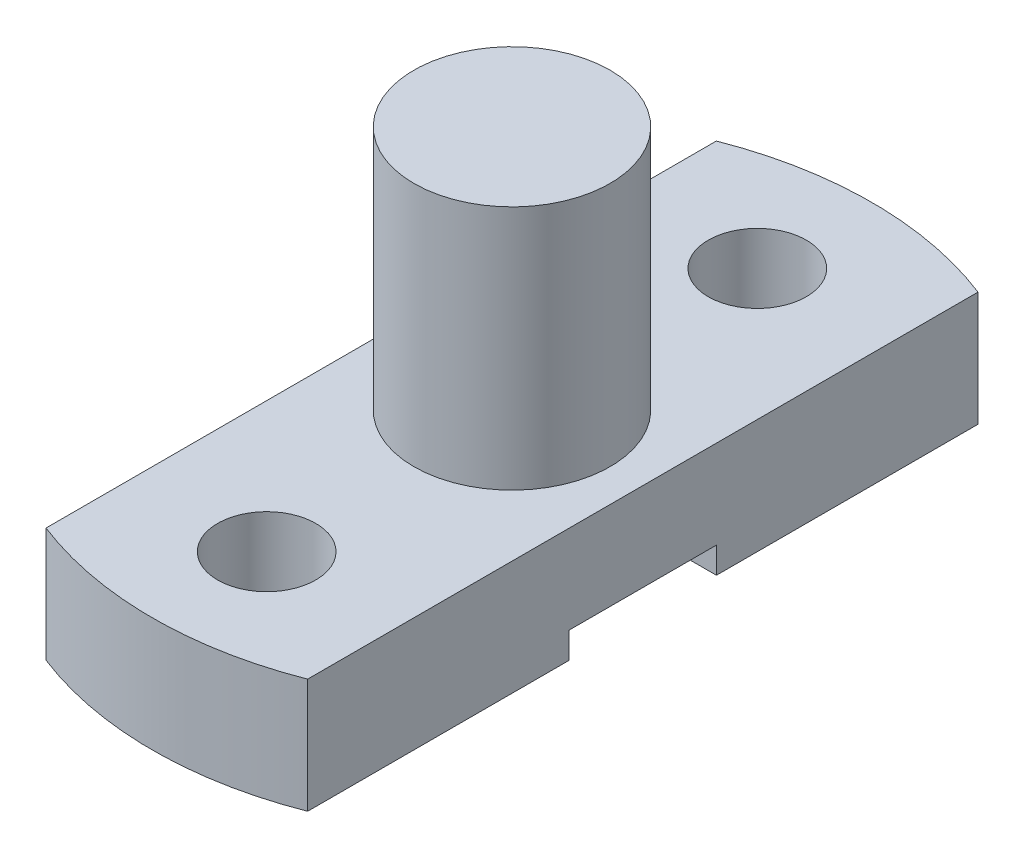
ISO-10303-21;
HEADER;
FILE_DESCRIPTION(('STEP AP214'),'2;1');
FILE_NAME('part.step','',(''),(''),'','','');
FILE_SCHEMA(('AUTOMOTIVE_DESIGN { 1 0 10303 214 1 1 1 1 }'));
ENDSEC;
DATA;
#1=APPLICATION_CONTEXT('core data for automotive mechanical design processes');
#2=APPLICATION_PROTOCOL_DEFINITION('international standard','automotive_design',2000,#1);
#3=PRODUCT_CONTEXT('',#1,'mechanical');
#4=PRODUCT('Part','Part','',(#3));
#5=PRODUCT_RELATED_PRODUCT_CATEGORY('part','',(#4));
#6=PRODUCT_DEFINITION_FORMATION('','',#4);
#7=PRODUCT_DEFINITION_CONTEXT('part definition',#1,'design');
#8=PRODUCT_DEFINITION('design','',#6,#7);
#9=PRODUCT_DEFINITION_SHAPE('','',#8);
#10=(LENGTH_UNIT() NAMED_UNIT(*) SI_UNIT(.MILLI.,.METRE.));
#11=(NAMED_UNIT(*) PLANE_ANGLE_UNIT() SI_UNIT($,.RADIAN.));
#12=(NAMED_UNIT(*) SI_UNIT($,.STERADIAN.) SOLID_ANGLE_UNIT());
#13=UNCERTAINTY_MEASURE_WITH_UNIT(LENGTH_MEASURE(1.E-05),#10,'distance_accuracy_value','');
#14=(GEOMETRIC_REPRESENTATION_CONTEXT(3) GLOBAL_UNCERTAINTY_ASSIGNED_CONTEXT((#13)) GLOBAL_UNIT_ASSIGNED_CONTEXT((#10,
#11,#12)) REPRESENTATION_CONTEXT('',''));
#15=CARTESIAN_POINT('',(0.,0.,0.));
#16=DIRECTION('',(0.,0.,1.));
#17=DIRECTION('',(1.,0.,0.));
#18=AXIS2_PLACEMENT_3D('',#15,#16,#17);
#19=CARTESIAN_POINT('',(0.,0.,0.));
#20=DIRECTION('',(0.,1.,0.));
#21=DIRECTION('',(0.,0.,1.));
#22=AXIS2_PLACEMENT_3D('',#19,#20,#21);
#23=PLANE('',#22);
#24=CARTESIAN_POINT('',(0.,0.,-75.));
#25=DIRECTION('',(0.,1.,0.));
#26=DIRECTION('',(0.,0.,1.));
#27=AXIS2_PLACEMENT_3D('',#24,#25,#26);
#28=CIRCLE('',#27,15.);
#29=CARTESIAN_POINT('',(0.,0.,-60.));
#30=VERTEX_POINT('',#29);
#31=EDGE_CURVE('E155',#30,#30,#28,.T.);
#32=ORIENTED_EDGE('',*,*,#31,.T.);
#33=EDGE_LOOP('',(#32));
#34=FACE_BOUND('',#33,.T.);
#35=DIRECTION('',(0.,0.,-1.));
#36=VECTOR('',#35,1.);
#37=CARTESIAN_POINT('',(40.,0.,-102.469507659596));
#38=LINE('',#37,#36);
#39=CARTESIAN_POINT('',(40.,0.,-22.5));
#40=VERTEX_POINT('',#39);
#41=CARTESIAN_POINT('',(40.,0.,-102.469507659596));
#42=VERTEX_POINT('',#41);
#43=EDGE_CURVE('E173',#40,#42,#38,.T.);
#44=ORIENTED_EDGE('',*,*,#43,.F.);
#45=DIRECTION('',(1.,0.,0.));
#46=VECTOR('',#45,1.);
#47=CARTESIAN_POINT('',(-40.,0.,-22.5));
#48=LINE('',#47,#46);
#49=CARTESIAN_POINT('',(-40.,0.,-22.5));
#50=VERTEX_POINT('',#49);
#51=EDGE_CURVE('E139',#50,#40,#48,.T.);
#52=ORIENTED_EDGE('',*,*,#51,.F.);
#53=DIRECTION('',(0.,0.,1.));
#54=VECTOR('',#53,1.);
#55=CARTESIAN_POINT('',(-40.,0.,-102.469507659596));
#56=LINE('',#55,#54);
#57=CARTESIAN_POINT('',(-40.,0.,-102.469507659596));
#58=VERTEX_POINT('',#57);
#59=EDGE_CURVE('E130',#58,#50,#56,.T.);
#60=ORIENTED_EDGE('',*,*,#59,.F.);
#61=CARTESIAN_POINT('',(0.,0.,0.));
#62=DIRECTION('',(0.,1.,0.));
#63=DIRECTION('',(0.,0.,1.));
#64=AXIS2_PLACEMENT_3D('',#61,#62,#63);
#65=CIRCLE('',#64,110.);
#66=EDGE_CURVE('E177',#42,#58,#65,.T.);
#67=ORIENTED_EDGE('',*,*,#66,.F.);
#68=EDGE_LOOP('',(#44,#52,#60,#67));
#69=FACE_BOUND('',#68,.T.);
#70=ADVANCED_FACE('F37',(#34,#69),#23,.F.);
#71=CARTESIAN_POINT('',(0.,35.,0.));
#72=DIRECTION('',(0.,1.,0.));
#73=DIRECTION('',(0.,0.,1.));
#74=AXIS2_PLACEMENT_3D('',#71,#72,#73);
#75=PLANE('',#74);
#76=CARTESIAN_POINT('',(0.,35.,0.));
#77=DIRECTION('',(0.,1.,0.));
#78=DIRECTION('',(0.,0.,1.));
#79=AXIS2_PLACEMENT_3D('',#76,#77,#78);
#80=CIRCLE('',#79,30.);
#81=CARTESIAN_POINT('',(0.,35.,30.));
#82=VERTEX_POINT('',#81);
#83=EDGE_CURVE('E141',#82,#82,#80,.T.);
#84=ORIENTED_EDGE('',*,*,#83,.F.);
#85=EDGE_LOOP('',(#84));
#86=FACE_BOUND('',#85,.T.);
#87=CARTESIAN_POINT('',(0.,35.,-75.));
#88=DIRECTION('',(0.,1.,0.));
#89=DIRECTION('',(0.,0.,1.));
#90=AXIS2_PLACEMENT_3D('',#87,#88,#89);
#91=CIRCLE('',#90,15.);
#92=CARTESIAN_POINT('',(0.,35.,-60.));
#93=VERTEX_POINT('',#92);
#94=EDGE_CURVE('E158',#93,#93,#91,.T.);
#95=ORIENTED_EDGE('',*,*,#94,.F.);
#96=EDGE_LOOP('',(#95));
#97=FACE_BOUND('',#96,.T.);
#98=CARTESIAN_POINT('',(0.,35.,0.));
#99=DIRECTION('',(0.,1.,0.));
#100=DIRECTION('',(0.,0.,1.));
#101=AXIS2_PLACEMENT_3D('',#98,#99,#100);
#102=CIRCLE('',#101,110.);
#103=CARTESIAN_POINT('',(-40.,35.,102.469507659596));
#104=VERTEX_POINT('',#103);
#105=CARTESIAN_POINT('',(40.,35.,102.469507659596));
#106=VERTEX_POINT('',#105);
#107=EDGE_CURVE('E164',#104,#106,#102,.T.);
#108=ORIENTED_EDGE('',*,*,#107,.T.);
#109=DIRECTION('',(0.,0.,-1.));
#110=VECTOR('',#109,1.);
#111=CARTESIAN_POINT('',(40.,35.,-102.469507659596));
#112=LINE('',#111,#110);
#113=CARTESIAN_POINT('',(40.,35.,-102.469507659596));
#114=VERTEX_POINT('',#113);
#115=EDGE_CURVE('E88',#106,#114,#112,.T.);
#116=ORIENTED_EDGE('',*,*,#115,.T.);
#117=CARTESIAN_POINT('',(0.,35.,0.));
#118=DIRECTION('',(0.,1.,0.));
#119=DIRECTION('',(0.,0.,1.));
#120=AXIS2_PLACEMENT_3D('',#117,#118,#119);
#121=CIRCLE('',#120,110.);
#122=CARTESIAN_POINT('',(-40.,35.,-102.469507659596));
#123=VERTEX_POINT('',#122);
#124=EDGE_CURVE('E167',#114,#123,#121,.T.);
#125=ORIENTED_EDGE('',*,*,#124,.T.);
#126=DIRECTION('',(0.,0.,1.));
#127=VECTOR('',#126,1.);
#128=CARTESIAN_POINT('',(-40.,35.,-102.469507659596));
#129=LINE('',#128,#127);
#130=EDGE_CURVE('E61',#123,#104,#129,.T.);
#131=ORIENTED_EDGE('',*,*,#130,.T.);
#132=EDGE_LOOP('',(#108,#116,#125,#131));
#133=FACE_BOUND('',#132,.T.);
#134=CARTESIAN_POINT('',(0.,35.,75.));
#135=DIRECTION('',(0.,1.,0.));
#136=DIRECTION('',(0.,0.,1.));
#137=AXIS2_PLACEMENT_3D('',#134,#135,#136);
#138=CIRCLE('',#137,15.);
#139=CARTESIAN_POINT('',(0.,35.,90.));
#140=VERTEX_POINT('',#139);
#141=EDGE_CURVE('E152',#140,#140,#138,.T.);
#142=ORIENTED_EDGE('',*,*,#141,.F.);
#143=EDGE_LOOP('',(#142));
#144=FACE_BOUND('',#143,.T.);
#145=ADVANCED_FACE('F200',(#86,#97,#133,#144),#75,.T.);
#146=CARTESIAN_POINT('',(-40.,0.,22.5));
#147=VERTEX_POINT('',#146);
#148=CARTESIAN_POINT('',(-40.,0.,102.469507659596));
#149=VERTEX_POINT('',#148);
#150=EDGE_CURVE('E81',#147,#149,#56,.T.);
#151=ORIENTED_EDGE('',*,*,#150,.F.);
#152=DIRECTION('',(1.,0.,0.));
#153=VECTOR('',#152,1.);
#154=CARTESIAN_POINT('',(-40.,0.,22.5));
#155=LINE('',#154,#153);
#156=CARTESIAN_POINT('',(40.,0.,22.5));
#157=VERTEX_POINT('',#156);
#158=EDGE_CURVE('E142',#147,#157,#155,.T.);
#159=ORIENTED_EDGE('',*,*,#158,.T.);
#160=CARTESIAN_POINT('',(40.,0.,102.469507659596));
#161=VERTEX_POINT('',#160);
#162=EDGE_CURVE('E174',#161,#157,#38,.T.);
#163=ORIENTED_EDGE('',*,*,#162,.F.);
#164=CARTESIAN_POINT('',(0.,0.,0.));
#165=DIRECTION('',(0.,1.,0.));
#166=DIRECTION('',(0.,0.,1.));
#167=AXIS2_PLACEMENT_3D('',#164,#165,#166);
#168=CIRCLE('',#167,110.);
#169=EDGE_CURVE('E161',#149,#161,#168,.T.);
#170=ORIENTED_EDGE('',*,*,#169,.F.);
#171=EDGE_LOOP('',(#151,#159,#163,#170));
#172=FACE_BOUND('',#171,.T.);
#173=CARTESIAN_POINT('',(0.,0.,75.));
#174=DIRECTION('',(0.,1.,0.));
#175=DIRECTION('',(0.,0.,1.));
#176=AXIS2_PLACEMENT_3D('',#173,#174,#175);
#177=CIRCLE('',#176,15.);
#178=CARTESIAN_POINT('',(0.,0.,90.));
#179=VERTEX_POINT('',#178);
#180=EDGE_CURVE('E149',#179,#179,#177,.T.);
#181=ORIENTED_EDGE('',*,*,#180,.T.);
#182=EDGE_LOOP('',(#181));
#183=FACE_BOUND('',#182,.T.);
#184=ADVANCED_FACE('F194',(#172,#183),#23,.F.);
#185=CARTESIAN_POINT('',(0.,35.,0.));
#186=DIRECTION('',(0.,-1.,0.));
#187=DIRECTION('',(0.,0.,-1.));
#188=AXIS2_PLACEMENT_3D('',#185,#186,#187);
#189=CYLINDRICAL_SURFACE('',#188,110.);
#190=ORIENTED_EDGE('',*,*,#169,.T.);
#191=DIRECTION('',(0.,-1.,0.));
#192=VECTOR('',#191,1.);
#193=CARTESIAN_POINT('',(40.,35.,102.469507659596));
#194=LINE('',#193,#192);
#195=EDGE_CURVE('E11',#106,#161,#194,.T.);
#196=ORIENTED_EDGE('',*,*,#195,.F.);
#197=ORIENTED_EDGE('',*,*,#107,.F.);
#198=DIRECTION('',(0.,-1.,0.));
#199=VECTOR('',#198,1.);
#200=CARTESIAN_POINT('',(-40.,35.,102.469507659596));
#201=LINE('',#200,#199);
#202=EDGE_CURVE('E170',#104,#149,#201,.T.);
#203=ORIENTED_EDGE('',*,*,#202,.T.);
#204=EDGE_LOOP('',(#190,#196,#197,#203));
#205=FACE_BOUND('',#204,.T.);
#206=ADVANCED_FACE('F39',(#205),#189,.T.);
#207=CARTESIAN_POINT('',(40.,35.,-102.469507659596));
#208=DIRECTION('',(-1.,0.,0.));
#209=DIRECTION('',(0.,0.,1.));
#210=AXIS2_PLACEMENT_3D('',#207,#208,#209);
#211=PLANE('',#210);
#212=DIRECTION('',(0.,0.,1.));
#213=VECTOR('',#212,1.);
#214=CARTESIAN_POINT('',(40.,8.00000000000004,-22.5));
#215=LINE('',#214,#213);
#216=CARTESIAN_POINT('',(40.,8.00000000000004,-22.5));
#217=VERTEX_POINT('',#216);
#218=CARTESIAN_POINT('',(40.,8.00000000000001,22.5));
#219=VERTEX_POINT('',#218);
#220=EDGE_CURVE('E133',#217,#219,#215,.T.);
#221=ORIENTED_EDGE('',*,*,#220,.F.);
#222=DIRECTION('',(0.,1.,0.));
#223=VECTOR('',#222,1.);
#224=CARTESIAN_POINT('',(40.,0.,-22.5));
#225=LINE('',#224,#223);
#226=EDGE_CURVE('E116',#40,#217,#225,.T.);
#227=ORIENTED_EDGE('',*,*,#226,.F.);
#228=ORIENTED_EDGE('',*,*,#43,.T.);
#229=DIRECTION('',(0.,-1.,0.));
#230=VECTOR('',#229,1.);
#231=CARTESIAN_POINT('',(40.,35.,-102.469507659596));
#232=LINE('',#231,#230);
#233=EDGE_CURVE('E45',#114,#42,#232,.T.);
#234=ORIENTED_EDGE('',*,*,#233,.F.);
#235=ORIENTED_EDGE('',*,*,#115,.F.);
#236=ORIENTED_EDGE('',*,*,#195,.T.);
#237=ORIENTED_EDGE('',*,*,#162,.T.);
#238=DIRECTION('',(0.,-1.,0.));
#239=VECTOR('',#238,1.);
#240=CARTESIAN_POINT('',(40.,0.,22.5));
#241=LINE('',#240,#239);
#242=EDGE_CURVE('E131',#219,#157,#241,.T.);
#243=ORIENTED_EDGE('',*,*,#242,.F.);
#244=EDGE_LOOP('',(#221,#227,#228,#234,#235,#236,#237,#243));
#245=FACE_BOUND('',#244,.T.);
#246=ADVANCED_FACE('F190',(#245),#211,.F.);
#247=CARTESIAN_POINT('',(0.,35.,0.));
#248=DIRECTION('',(0.,-1.,0.));
#249=DIRECTION('',(0.,0.,-1.));
#250=AXIS2_PLACEMENT_3D('',#247,#248,#249);
#251=CYLINDRICAL_SURFACE('',#250,110.);
#252=ORIENTED_EDGE('',*,*,#66,.T.);
#253=DIRECTION('',(0.,-1.,0.));
#254=VECTOR('',#253,1.);
#255=CARTESIAN_POINT('',(-40.,35.,-102.469507659596));
#256=LINE('',#255,#254);
#257=EDGE_CURVE('E181',#123,#58,#256,.T.);
#258=ORIENTED_EDGE('',*,*,#257,.F.);
#259=ORIENTED_EDGE('',*,*,#124,.F.);
#260=ORIENTED_EDGE('',*,*,#233,.T.);
#261=EDGE_LOOP('',(#252,#258,#259,#260));
#262=FACE_BOUND('',#261,.T.);
#263=ADVANCED_FACE('F186',(#262),#251,.T.);
#264=CARTESIAN_POINT('',(-40.,35.,-102.469507659596));
#265=DIRECTION('',(1.,0.,0.));
#266=DIRECTION('',(0.,0.,-1.));
#267=AXIS2_PLACEMENT_3D('',#264,#265,#266);
#268=PLANE('',#267);
#269=ORIENTED_EDGE('',*,*,#59,.T.);
#270=DIRECTION('',(0.,1.,0.));
#271=VECTOR('',#270,1.);
#272=CARTESIAN_POINT('',(-40.,0.,-22.5));
#273=LINE('',#272,#271);
#274=CARTESIAN_POINT('',(-40.,8.00000000000004,-22.5));
#275=VERTEX_POINT('',#274);
#276=EDGE_CURVE('E113',#50,#275,#273,.T.);
#277=ORIENTED_EDGE('',*,*,#276,.T.);
#278=DIRECTION('',(0.,0.,1.));
#279=VECTOR('',#278,1.);
#280=CARTESIAN_POINT('',(-40.,8.00000000000004,-22.5));
#281=LINE('',#280,#279);
#282=CARTESIAN_POINT('',(-40.,8.00000000000001,22.5));
#283=VERTEX_POINT('',#282);
#284=EDGE_CURVE('E123',#275,#283,#281,.T.);
#285=ORIENTED_EDGE('',*,*,#284,.T.);
#286=DIRECTION('',(0.,-1.,0.));
#287=VECTOR('',#286,1.);
#288=CARTESIAN_POINT('',(-40.,0.,22.5));
#289=LINE('',#288,#287);
#290=EDGE_CURVE('E52',#283,#147,#289,.T.);
#291=ORIENTED_EDGE('',*,*,#290,.T.);
#292=ORIENTED_EDGE('',*,*,#150,.T.);
#293=ORIENTED_EDGE('',*,*,#202,.F.);
#294=ORIENTED_EDGE('',*,*,#130,.F.);
#295=ORIENTED_EDGE('',*,*,#257,.T.);
#296=EDGE_LOOP('',(#269,#277,#285,#291,#292,#293,#294,#295));
#297=FACE_BOUND('',#296,.T.);
#298=ADVANCED_FACE('F127',(#297),#268,.F.);
#299=CARTESIAN_POINT('',(0.,35.,-75.));
#300=DIRECTION('',(0.,-1.,0.));
#301=DIRECTION('',(0.,0.,-1.));
#302=AXIS2_PLACEMENT_3D('',#299,#300,#301);
#303=CYLINDRICAL_SURFACE('',#302,15.);
#304=ORIENTED_EDGE('',*,*,#94,.T.);
#305=EDGE_LOOP('',(#304));
#306=FACE_BOUND('',#305,.T.);
#307=ORIENTED_EDGE('',*,*,#31,.F.);
#308=EDGE_LOOP('',(#307));
#309=FACE_BOUND('',#308,.T.);
#310=ADVANCED_FACE('F211',(#306,#309),#303,.F.);
#311=CARTESIAN_POINT('',(0.,35.,75.));
#312=DIRECTION('',(0.,-1.,0.));
#313=DIRECTION('',(0.,0.,-1.));
#314=AXIS2_PLACEMENT_3D('',#311,#312,#313);
#315=CYLINDRICAL_SURFACE('',#314,15.);
#316=ORIENTED_EDGE('',*,*,#141,.T.);
#317=EDGE_LOOP('',(#316));
#318=FACE_BOUND('',#317,.T.);
#319=ORIENTED_EDGE('',*,*,#180,.F.);
#320=EDGE_LOOP('',(#319));
#321=FACE_BOUND('',#320,.T.);
#322=ADVANCED_FACE('F207',(#318,#321),#315,.F.);
#323=CARTESIAN_POINT('',(0.,110.,0.));
#324=DIRECTION('',(0.,-1.,0.));
#325=DIRECTION('',(0.,0.,-1.));
#326=AXIS2_PLACEMENT_3D('',#323,#324,#325);
#327=CYLINDRICAL_SURFACE('',#326,30.);
#328=CARTESIAN_POINT('',(0.,110.,0.));
#329=DIRECTION('',(0.,1.,0.));
#330=DIRECTION('',(0.,0.,1.));
#331=AXIS2_PLACEMENT_3D('',#328,#329,#330);
#332=CIRCLE('',#331,30.);
#333=CARTESIAN_POINT('',(0.,110.,30.));
#334=VERTEX_POINT('',#333);
#335=EDGE_CURVE('E146',#334,#334,#332,.T.);
#336=ORIENTED_EDGE('',*,*,#335,.F.);
#337=EDGE_LOOP('',(#336));
#338=FACE_BOUND('',#337,.T.);
#339=ORIENTED_EDGE('',*,*,#83,.T.);
#340=EDGE_LOOP('',(#339));
#341=FACE_BOUND('',#340,.T.);
#342=ADVANCED_FACE('F210',(#338,#341),#327,.T.);
#343=CARTESIAN_POINT('',(0.,110.,0.));
#344=DIRECTION('',(0.,1.,0.));
#345=DIRECTION('',(0.,0.,1.));
#346=AXIS2_PLACEMENT_3D('',#343,#344,#345);
#347=PLANE('',#346);
#348=ORIENTED_EDGE('',*,*,#335,.T.);
#349=EDGE_LOOP('',(#348));
#350=FACE_BOUND('',#349,.T.);
#351=ADVANCED_FACE('F235',(#350),#347,.T.);
#352=CARTESIAN_POINT('',(-40.,0.,-22.5));
#353=DIRECTION('',(0.,0.,-1.));
#354=DIRECTION('',(-1.,0.,0.));
#355=AXIS2_PLACEMENT_3D('',#352,#353,#354);
#356=PLANE('',#355);
#357=ORIENTED_EDGE('',*,*,#226,.T.);
#358=DIRECTION('',(1.,0.,0.));
#359=VECTOR('',#358,1.);
#360=CARTESIAN_POINT('',(-40.,8.00000000000004,-22.5));
#361=LINE('',#360,#359);
#362=EDGE_CURVE('E109',#275,#217,#361,.T.);
#363=ORIENTED_EDGE('',*,*,#362,.F.);
#364=ORIENTED_EDGE('',*,*,#276,.F.);
#365=ORIENTED_EDGE('',*,*,#51,.T.);
#366=EDGE_LOOP('',(#357,#363,#364,#365));
#367=FACE_BOUND('',#366,.T.);
#368=ADVANCED_FACE('F111',(#367),#356,.F.);
#369=CARTESIAN_POINT('',(-40.,0.,22.5));
#370=DIRECTION('',(0.,0.,1.));
#371=DIRECTION('',(1.,0.,0.));
#372=AXIS2_PLACEMENT_3D('',#369,#370,#371);
#373=PLANE('',#372);
#374=ORIENTED_EDGE('',*,*,#242,.T.);
#375=ORIENTED_EDGE('',*,*,#158,.F.);
#376=ORIENTED_EDGE('',*,*,#290,.F.);
#377=DIRECTION('',(1.,0.,0.));
#378=VECTOR('',#377,1.);
#379=CARTESIAN_POINT('',(-40.,8.00000000000001,22.5));
#380=LINE('',#379,#378);
#381=EDGE_CURVE('E120',#283,#219,#380,.T.);
#382=ORIENTED_EDGE('',*,*,#381,.T.);
#383=EDGE_LOOP('',(#374,#375,#376,#382));
#384=FACE_BOUND('',#383,.T.);
#385=ADVANCED_FACE('F192',(#384),#373,.F.);
#386=CARTESIAN_POINT('',(-40.,8.00000000000004,-22.5));
#387=DIRECTION('',(0.,1.,0.));
#388=DIRECTION('',(0.,0.,1.));
#389=AXIS2_PLACEMENT_3D('',#386,#387,#388);
#390=PLANE('',#389);
#391=ORIENTED_EDGE('',*,*,#220,.T.);
#392=ORIENTED_EDGE('',*,*,#381,.F.);
#393=ORIENTED_EDGE('',*,*,#284,.F.);
#394=ORIENTED_EDGE('',*,*,#362,.T.);
#395=EDGE_LOOP('',(#391,#392,#393,#394));
#396=FACE_BOUND('',#395,.T.);
#397=ADVANCED_FACE('F124',(#396),#390,.F.);
#398=CLOSED_SHELL('',(#70,#145,#184,#206,#246,#263,#298,#310,#322,#342,#351,#368,#385,#397));
#399=MANIFOLD_SOLID_BREP('B2',#398);
#400=ADVANCED_BREP_SHAPE_REPRESENTATION('',(#18,#399),#14);
#401=SHAPE_DEFINITION_REPRESENTATION(#9,#400);
ENDSEC;
END-ISO-10303-21;
